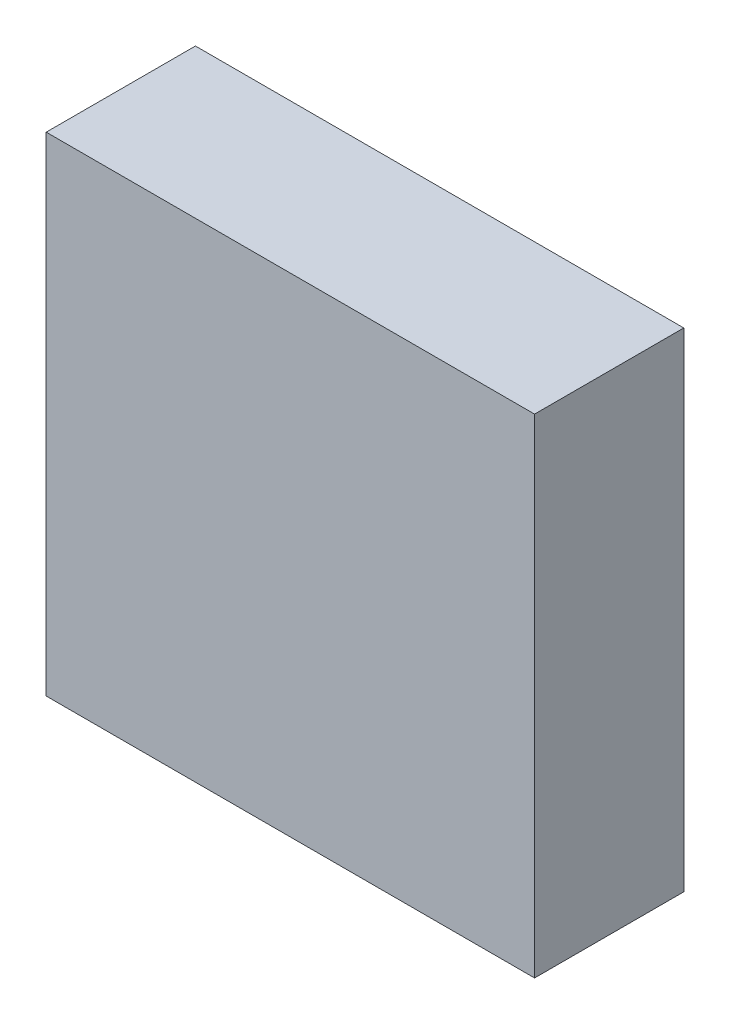
ISO-10303-21;
HEADER;
FILE_DESCRIPTION(('STEP AP214'),'2;1');
FILE_NAME('part.step','',(''),(''),'','','');
FILE_SCHEMA(('AUTOMOTIVE_DESIGN { 1 0 10303 214 1 1 1 1 }'));
ENDSEC;
DATA;
#1=APPLICATION_CONTEXT('core data for automotive mechanical design processes');
#2=APPLICATION_PROTOCOL_DEFINITION('international standard','automotive_design',2000,#1);
#3=PRODUCT_CONTEXT('',#1,'mechanical');
#4=PRODUCT('Part','Part','',(#3));
#5=PRODUCT_RELATED_PRODUCT_CATEGORY('part','',(#4));
#6=PRODUCT_DEFINITION_FORMATION('','',#4);
#7=PRODUCT_DEFINITION_CONTEXT('part definition',#1,'design');
#8=PRODUCT_DEFINITION('design','',#6,#7);
#9=PRODUCT_DEFINITION_SHAPE('','',#8);
#10=(LENGTH_UNIT() NAMED_UNIT(*) SI_UNIT(.MILLI.,.METRE.));
#11=(NAMED_UNIT(*) PLANE_ANGLE_UNIT() SI_UNIT($,.RADIAN.));
#12=(NAMED_UNIT(*) SI_UNIT($,.STERADIAN.) SOLID_ANGLE_UNIT());
#13=UNCERTAINTY_MEASURE_WITH_UNIT(LENGTH_MEASURE(1.E-05),#10,'distance_accuracy_value','');
#14=(GEOMETRIC_REPRESENTATION_CONTEXT(3) GLOBAL_UNCERTAINTY_ASSIGNED_CONTEXT((#13)) GLOBAL_UNIT_ASSIGNED_CONTEXT((#10,
#11,#12)) REPRESENTATION_CONTEXT('',''));
#15=CARTESIAN_POINT('',(0.,0.,0.));
#16=DIRECTION('',(0.,0.,1.));
#17=DIRECTION('',(1.,0.,0.));
#18=AXIS2_PLACEMENT_3D('',#15,#16,#17);
#19=CARTESIAN_POINT('',(18.,18.,11.));
#20=DIRECTION('',(-1.,0.,0.));
#21=DIRECTION('',(0.,-1.,0.));
#22=AXIS2_PLACEMENT_3D('',#19,#20,#21);
#23=PLANE('',#22);
#24=DIRECTION('',(0.,1.,0.));
#25=VECTOR('',#24,1.);
#26=CARTESIAN_POINT('',(18.,18.,0.));
#27=LINE('',#26,#25);
#28=CARTESIAN_POINT('',(18.,-18.,0.));
#29=VERTEX_POINT('',#28);
#30=CARTESIAN_POINT('',(18.,18.,0.));
#31=VERTEX_POINT('',#30);
#32=EDGE_CURVE('E104',#29,#31,#27,.T.);
#33=ORIENTED_EDGE('',*,*,#32,.T.);
#34=DIRECTION('',(0.,0.,-1.));
#35=VECTOR('',#34,1.);
#36=CARTESIAN_POINT('',(18.,18.,11.));
#37=LINE('',#36,#35);
#38=CARTESIAN_POINT('',(18.,18.,11.));
#39=VERTEX_POINT('',#38);
#40=EDGE_CURVE('E11',#39,#31,#37,.T.);
#41=ORIENTED_EDGE('',*,*,#40,.F.);
#42=DIRECTION('',(0.,1.,0.));
#43=VECTOR('',#42,1.);
#44=CARTESIAN_POINT('',(18.,18.,11.));
#45=LINE('',#44,#43);
#46=CARTESIAN_POINT('',(18.,-18.,11.));
#47=VERTEX_POINT('',#46);
#48=EDGE_CURVE('E92',#47,#39,#45,.T.);
#49=ORIENTED_EDGE('',*,*,#48,.F.);
#50=DIRECTION('',(0.,0.,-1.));
#51=VECTOR('',#50,1.);
#52=CARTESIAN_POINT('',(18.,-18.,11.));
#53=LINE('',#52,#51);
#54=EDGE_CURVE('E100',#47,#29,#53,.T.);
#55=ORIENTED_EDGE('',*,*,#54,.T.);
#56=EDGE_LOOP('',(#33,#41,#49,#55));
#57=FACE_BOUND('',#56,.T.);
#58=ADVANCED_FACE('F41',(#57),#23,.F.);
#59=CARTESIAN_POINT('',(-18.,18.,11.));
#60=DIRECTION('',(0.,-1.,0.));
#61=DIRECTION('',(0.,0.,-1.));
#62=AXIS2_PLACEMENT_3D('',#59,#60,#61);
#63=PLANE('',#62);
#64=DIRECTION('',(-1.,0.,0.));
#65=VECTOR('',#64,1.);
#66=CARTESIAN_POINT('',(-18.,18.,0.));
#67=LINE('',#66,#65);
#68=CARTESIAN_POINT('',(-18.,18.,0.));
#69=VERTEX_POINT('',#68);
#70=EDGE_CURVE('E96',#31,#69,#67,.T.);
#71=ORIENTED_EDGE('',*,*,#70,.T.);
#72=DIRECTION('',(0.,0.,-1.));
#73=VECTOR('',#72,1.);
#74=CARTESIAN_POINT('',(-18.,18.,11.));
#75=LINE('',#74,#73);
#76=CARTESIAN_POINT('',(-18.,18.,11.));
#77=VERTEX_POINT('',#76);
#78=EDGE_CURVE('E49',#77,#69,#75,.T.);
#79=ORIENTED_EDGE('',*,*,#78,.F.);
#80=DIRECTION('',(-1.,0.,0.));
#81=VECTOR('',#80,1.);
#82=CARTESIAN_POINT('',(-18.,18.,11.));
#83=LINE('',#82,#81);
#84=EDGE_CURVE('E87',#39,#77,#83,.T.);
#85=ORIENTED_EDGE('',*,*,#84,.F.);
#86=ORIENTED_EDGE('',*,*,#40,.T.);
#87=EDGE_LOOP('',(#71,#79,#85,#86));
#88=FACE_BOUND('',#87,.T.);
#89=ADVANCED_FACE('F95',(#88),#63,.F.);
#90=CARTESIAN_POINT('',(-18.,18.,11.));
#91=DIRECTION('',(1.,0.,0.));
#92=DIRECTION('',(0.,1.,0.));
#93=AXIS2_PLACEMENT_3D('',#90,#91,#92);
#94=PLANE('',#93);
#95=DIRECTION('',(0.,-1.,0.));
#96=VECTOR('',#95,1.);
#97=CARTESIAN_POINT('',(-18.,18.,0.));
#98=LINE('',#97,#96);
#99=CARTESIAN_POINT('',(-18.,-18.,0.));
#100=VERTEX_POINT('',#99);
#101=EDGE_CURVE('E74',#69,#100,#98,.T.);
#102=ORIENTED_EDGE('',*,*,#101,.T.);
#103=DIRECTION('',(0.,0.,-1.));
#104=VECTOR('',#103,1.);
#105=CARTESIAN_POINT('',(-18.,-18.,11.));
#106=LINE('',#105,#104);
#107=CARTESIAN_POINT('',(-18.,-18.,11.));
#108=VERTEX_POINT('',#107);
#109=EDGE_CURVE('E97',#108,#100,#106,.T.);
#110=ORIENTED_EDGE('',*,*,#109,.F.);
#111=DIRECTION('',(0.,-1.,0.));
#112=VECTOR('',#111,1.);
#113=CARTESIAN_POINT('',(-18.,18.,11.));
#114=LINE('',#113,#112);
#115=EDGE_CURVE('E90',#77,#108,#114,.T.);
#116=ORIENTED_EDGE('',*,*,#115,.F.);
#117=ORIENTED_EDGE('',*,*,#78,.T.);
#118=EDGE_LOOP('',(#102,#110,#116,#117));
#119=FACE_BOUND('',#118,.T.);
#120=ADVANCED_FACE('F98',(#119),#94,.F.);
#121=CARTESIAN_POINT('',(-18.,-18.,11.));
#122=DIRECTION('',(0.,1.,0.));
#123=DIRECTION('',(0.,0.,1.));
#124=AXIS2_PLACEMENT_3D('',#121,#122,#123);
#125=PLANE('',#124);
#126=DIRECTION('',(1.,0.,0.));
#127=VECTOR('',#126,1.);
#128=CARTESIAN_POINT('',(-18.,-18.,0.));
#129=LINE('',#128,#127);
#130=EDGE_CURVE('E80',#100,#29,#129,.T.);
#131=ORIENTED_EDGE('',*,*,#130,.T.);
#132=ORIENTED_EDGE('',*,*,#54,.F.);
#133=DIRECTION('',(1.,0.,0.));
#134=VECTOR('',#133,1.);
#135=CARTESIAN_POINT('',(-18.,-18.,11.));
#136=LINE('',#135,#134);
#137=EDGE_CURVE('E57',#108,#47,#136,.T.);
#138=ORIENTED_EDGE('',*,*,#137,.F.);
#139=ORIENTED_EDGE('',*,*,#109,.T.);
#140=EDGE_LOOP('',(#131,#132,#138,#139));
#141=FACE_BOUND('',#140,.T.);
#142=ADVANCED_FACE('F111',(#141),#125,.F.);
#143=CARTESIAN_POINT('',(0.,0.,11.));
#144=DIRECTION('',(0.,0.,1.));
#145=DIRECTION('',(1.,0.,0.));
#146=AXIS2_PLACEMENT_3D('',#143,#144,#145);
#147=PLANE('',#146);
#148=ORIENTED_EDGE('',*,*,#48,.T.);
#149=ORIENTED_EDGE('',*,*,#84,.T.);
#150=ORIENTED_EDGE('',*,*,#115,.T.);
#151=ORIENTED_EDGE('',*,*,#137,.T.);
#152=EDGE_LOOP('',(#148,#149,#150,#151));
#153=FACE_BOUND('',#152,.T.);
#154=ADVANCED_FACE('F88',(#153),#147,.T.);
#155=CARTESIAN_POINT('',(0.,0.,0.));
#156=DIRECTION('',(0.,0.,1.));
#157=DIRECTION('',(1.,0.,0.));
#158=AXIS2_PLACEMENT_3D('',#155,#156,#157);
#159=PLANE('',#158);
#160=ORIENTED_EDGE('',*,*,#32,.F.);
#161=ORIENTED_EDGE('',*,*,#130,.F.);
#162=ORIENTED_EDGE('',*,*,#101,.F.);
#163=ORIENTED_EDGE('',*,*,#70,.F.);
#164=EDGE_LOOP('',(#160,#161,#162,#163));
#165=FACE_BOUND('',#164,.T.);
#166=ADVANCED_FACE('F114',(#165),#159,.F.);
#167=CLOSED_SHELL('',(#58,#89,#120,#142,#154,#166));
#168=MANIFOLD_SOLID_BREP('B2',#167);
#169=ADVANCED_BREP_SHAPE_REPRESENTATION('',(#18,#168),#14);
#170=SHAPE_DEFINITION_REPRESENTATION(#9,#169);
ENDSEC;
END-ISO-10303-21;
